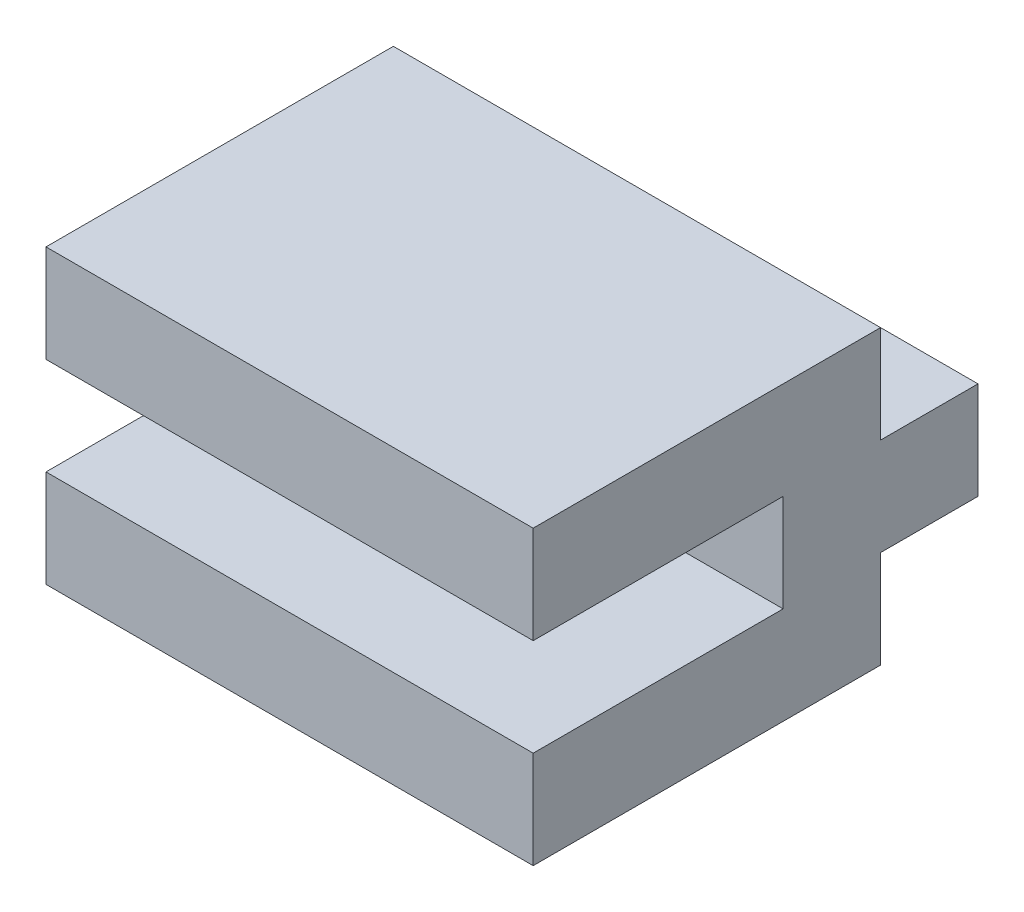
ISO-10303-21;
HEADER;
FILE_DESCRIPTION(('STEP AP214'),'2;1');
FILE_NAME('part.step','',(''),(''),'','','');
FILE_SCHEMA(('AUTOMOTIVE_DESIGN { 1 0 10303 214 1 1 1 1 }'));
ENDSEC;
DATA;
#1=APPLICATION_CONTEXT('core data for automotive mechanical design processes');
#2=APPLICATION_PROTOCOL_DEFINITION('international standard','automotive_design',2000,#1);
#3=PRODUCT_CONTEXT('',#1,'mechanical');
#4=PRODUCT('Part','Part','',(#3));
#5=PRODUCT_RELATED_PRODUCT_CATEGORY('part','',(#4));
#6=PRODUCT_DEFINITION_FORMATION('','',#4);
#7=PRODUCT_DEFINITION_CONTEXT('part definition',#1,'design');
#8=PRODUCT_DEFINITION('design','',#6,#7);
#9=PRODUCT_DEFINITION_SHAPE('','',#8);
#10=(LENGTH_UNIT() NAMED_UNIT(*) SI_UNIT(.MILLI.,.METRE.));
#11=(NAMED_UNIT(*) PLANE_ANGLE_UNIT() SI_UNIT($,.RADIAN.));
#12=(NAMED_UNIT(*) SI_UNIT($,.STERADIAN.) SOLID_ANGLE_UNIT());
#13=UNCERTAINTY_MEASURE_WITH_UNIT(LENGTH_MEASURE(1.E-05),#10,'distance_accuracy_value','');
#14=(GEOMETRIC_REPRESENTATION_CONTEXT(3) GLOBAL_UNCERTAINTY_ASSIGNED_CONTEXT((#13)) GLOBAL_UNIT_ASSIGNED_CONTEXT((#10,
#11,#12)) REPRESENTATION_CONTEXT('',''));
#15=CARTESIAN_POINT('',(0.,0.,0.));
#16=DIRECTION('',(0.,0.,1.));
#17=DIRECTION('',(1.,0.,0.));
#18=AXIS2_PLACEMENT_3D('',#15,#16,#17);
#19=CARTESIAN_POINT('',(10.,1.,3.56528437442263));
#20=DIRECTION('',(0.,0.,-1.));
#21=DIRECTION('',(-1.,0.,0.));
#22=AXIS2_PLACEMENT_3D('',#19,#20,#21);
#23=PLANE('',#22);
#24=DIRECTION('',(0.,-1.,0.));
#25=VECTOR('',#24,1.);
#26=CARTESIAN_POINT('',(0.,1.,3.56528437442263));
#27=LINE('',#26,#25);
#28=CARTESIAN_POINT('',(0.,3.,3.56528437442263));
#29=VERTEX_POINT('',#28);
#30=CARTESIAN_POINT('',(0.,1.,3.56528437442263));
#31=VERTEX_POINT('',#30);
#32=EDGE_CURVE('E164',#29,#31,#27,.T.);
#33=ORIENTED_EDGE('',*,*,#32,.T.);
#34=DIRECTION('',(-1.,0.,0.));
#35=VECTOR('',#34,1.);
#36=CARTESIAN_POINT('',(10.,1.,3.56528437442263));
#37=LINE('',#36,#35);
#38=CARTESIAN_POINT('',(10.,1.,3.56528437442263));
#39=VERTEX_POINT('',#38);
#40=EDGE_CURVE('E11',#39,#31,#37,.T.);
#41=ORIENTED_EDGE('',*,*,#40,.F.);
#42=DIRECTION('',(0.,-1.,0.));
#43=VECTOR('',#42,1.);
#44=CARTESIAN_POINT('',(10.,1.,3.56528437442263));
#45=LINE('',#44,#43);
#46=CARTESIAN_POINT('',(10.,3.,3.56528437442263));
#47=VERTEX_POINT('',#46);
#48=EDGE_CURVE('E198',#47,#39,#45,.T.);
#49=ORIENTED_EDGE('',*,*,#48,.F.);
#50=DIRECTION('',(-1.,0.,0.));
#51=VECTOR('',#50,1.);
#52=CARTESIAN_POINT('',(10.,3.,3.56528437442263));
#53=LINE('',#52,#51);
#54=EDGE_CURVE('E160',#47,#29,#53,.T.);
#55=ORIENTED_EDGE('',*,*,#54,.T.);
#56=EDGE_LOOP('',(#33,#41,#49,#55));
#57=FACE_BOUND('',#56,.T.);
#58=ADVANCED_FACE('F39',(#57),#23,.F.);
#59=CARTESIAN_POINT('',(10.,1.,-1.56528437442264));
#60=DIRECTION('',(0.,1.,0.));
#61=DIRECTION('',(0.,0.,1.));
#62=AXIS2_PLACEMENT_3D('',#59,#60,#61);
#63=PLANE('',#62);
#64=DIRECTION('',(0.,0.,-1.));
#65=VECTOR('',#64,1.);
#66=CARTESIAN_POINT('',(0.,1.,-1.56528437442264));
#67=LINE('',#66,#65);
#68=CARTESIAN_POINT('',(0.,1.,-1.56528437442264));
#69=VERTEX_POINT('',#68);
#70=EDGE_CURVE('E168',#31,#69,#67,.T.);
#71=ORIENTED_EDGE('',*,*,#70,.T.);
#72=DIRECTION('',(-1.,0.,0.));
#73=VECTOR('',#72,1.);
#74=CARTESIAN_POINT('',(10.,1.,-1.56528437442264));
#75=LINE('',#74,#73);
#76=CARTESIAN_POINT('',(10.,1.,-1.56528437442264));
#77=VERTEX_POINT('',#76);
#78=EDGE_CURVE('E48',#77,#69,#75,.T.);
#79=ORIENTED_EDGE('',*,*,#78,.F.);
#80=DIRECTION('',(0.,0.,-1.));
#81=VECTOR('',#80,1.);
#82=CARTESIAN_POINT('',(10.,1.,-1.56528437442264));
#83=LINE('',#82,#81);
#84=EDGE_CURVE('E111',#39,#77,#83,.T.);
#85=ORIENTED_EDGE('',*,*,#84,.F.);
#86=ORIENTED_EDGE('',*,*,#40,.T.);
#87=EDGE_LOOP('',(#71,#79,#85,#86));
#88=FACE_BOUND('',#87,.T.);
#89=ADVANCED_FACE('F292',(#88),#63,.F.);
#90=CARTESIAN_POINT('',(10.,-0.999999999999999,-1.56528437442264));
#91=DIRECTION('',(0.,0.,-1.));
#92=DIRECTION('',(0.,1.,0.));
#93=AXIS2_PLACEMENT_3D('',#90,#91,#92);
#94=PLANE('',#93);
#95=DIRECTION('',(0.,-1.,0.));
#96=VECTOR('',#95,1.);
#97=CARTESIAN_POINT('',(0.,-0.999999999999999,-1.56528437442264));
#98=LINE('',#97,#96);
#99=CARTESIAN_POINT('',(0.,-0.999999999999999,-1.56528437442264));
#100=VERTEX_POINT('',#99);
#101=EDGE_CURVE('E171',#69,#100,#98,.T.);
#102=ORIENTED_EDGE('',*,*,#101,.T.);
#103=DIRECTION('',(-1.,0.,0.));
#104=VECTOR('',#103,1.);
#105=CARTESIAN_POINT('',(10.,-0.999999999999999,-1.56528437442264));
#106=LINE('',#105,#104);
#107=CARTESIAN_POINT('',(10.,-0.999999999999999,-1.56528437442264));
#108=VERTEX_POINT('',#107);
#109=EDGE_CURVE('E225',#108,#100,#106,.T.);
#110=ORIENTED_EDGE('',*,*,#109,.F.);
#111=DIRECTION('',(0.,-1.,0.));
#112=VECTOR('',#111,1.);
#113=CARTESIAN_POINT('',(10.,-0.999999999999999,-1.56528437442264));
#114=LINE('',#113,#112);
#115=EDGE_CURVE('E235',#77,#108,#114,.T.);
#116=ORIENTED_EDGE('',*,*,#115,.F.);
#117=ORIENTED_EDGE('',*,*,#78,.T.);
#118=EDGE_LOOP('',(#102,#110,#116,#117));
#119=FACE_BOUND('',#118,.T.);
#120=ADVANCED_FACE('F233',(#119),#94,.F.);
#121=CARTESIAN_POINT('',(10.,-0.999999999999999,-1.56528437442264));
#122=DIRECTION('',(0.,-1.,0.));
#123=DIRECTION('',(0.,0.,-1.));
#124=AXIS2_PLACEMENT_3D('',#121,#122,#123);
#125=PLANE('',#124);
#126=DIRECTION('',(0.,0.,1.));
#127=VECTOR('',#126,1.);
#128=CARTESIAN_POINT('',(0.,-0.999999999999999,-1.56528437442264));
#129=LINE('',#128,#127);
#130=CARTESIAN_POINT('',(0.,-0.999999999999999,3.56528437442263));
#131=VERTEX_POINT('',#130);
#132=EDGE_CURVE('E174',#100,#131,#129,.T.);
#133=ORIENTED_EDGE('',*,*,#132,.T.);
#134=DIRECTION('',(-1.,0.,0.));
#135=VECTOR('',#134,1.);
#136=CARTESIAN_POINT('',(10.,-0.999999999999999,3.56528437442263));
#137=LINE('',#136,#135);
#138=CARTESIAN_POINT('',(10.,-0.999999999999999,3.56528437442263));
#139=VERTEX_POINT('',#138);
#140=EDGE_CURVE('E221',#139,#131,#137,.T.);
#141=ORIENTED_EDGE('',*,*,#140,.F.);
#142=DIRECTION('',(0.,0.,1.));
#143=VECTOR('',#142,1.);
#144=CARTESIAN_POINT('',(10.,-0.999999999999999,-1.56528437442264));
#145=LINE('',#144,#143);
#146=EDGE_CURVE('E254',#108,#139,#145,.T.);
#147=ORIENTED_EDGE('',*,*,#146,.F.);
#148=ORIENTED_EDGE('',*,*,#109,.T.);
#149=EDGE_LOOP('',(#133,#141,#147,#148));
#150=FACE_BOUND('',#149,.T.);
#151=ADVANCED_FACE('F244',(#150),#125,.F.);
#152=CARTESIAN_POINT('',(10.,-3.,3.56528437442263));
#153=DIRECTION('',(0.,0.,-1.));
#154=DIRECTION('',(-1.,0.,0.));
#155=AXIS2_PLACEMENT_3D('',#152,#153,#154);
#156=PLANE('',#155);
#157=DIRECTION('',(0.,-1.,0.));
#158=VECTOR('',#157,1.);
#159=CARTESIAN_POINT('',(0.,-3.,3.56528437442263));
#160=LINE('',#159,#158);
#161=CARTESIAN_POINT('',(0.,-3.,3.56528437442263));
#162=VERTEX_POINT('',#161);
#163=EDGE_CURVE('E177',#131,#162,#160,.T.);
#164=ORIENTED_EDGE('',*,*,#163,.T.);
#165=DIRECTION('',(-1.,0.,0.));
#166=VECTOR('',#165,1.);
#167=CARTESIAN_POINT('',(10.,-3.,3.56528437442263));
#168=LINE('',#167,#166);
#169=CARTESIAN_POINT('',(10.,-3.,3.56528437442263));
#170=VERTEX_POINT('',#169);
#171=EDGE_CURVE('E217',#170,#162,#168,.T.);
#172=ORIENTED_EDGE('',*,*,#171,.F.);
#173=DIRECTION('',(0.,-1.,0.));
#174=VECTOR('',#173,1.);
#175=CARTESIAN_POINT('',(10.,-3.,3.56528437442263));
#176=LINE('',#175,#174);
#177=EDGE_CURVE('E250',#139,#170,#176,.T.);
#178=ORIENTED_EDGE('',*,*,#177,.F.);
#179=ORIENTED_EDGE('',*,*,#140,.T.);
#180=EDGE_LOOP('',(#164,#172,#178,#179));
#181=FACE_BOUND('',#180,.T.);
#182=ADVANCED_FACE('F248',(#181),#156,.F.);
#183=CARTESIAN_POINT('',(10.,-3.,-3.56528437442263));
#184=DIRECTION('',(0.,1.,0.));
#185=DIRECTION('',(0.,0.,1.));
#186=AXIS2_PLACEMENT_3D('',#183,#184,#185);
#187=PLANE('',#186);
#188=DIRECTION('',(0.,0.,-1.));
#189=VECTOR('',#188,1.);
#190=CARTESIAN_POINT('',(0.,-3.,-3.56528437442263));
#191=LINE('',#190,#189);
#192=CARTESIAN_POINT('',(0.,-3.,-3.56528437442263));
#193=VERTEX_POINT('',#192);
#194=EDGE_CURVE('E180',#162,#193,#191,.T.);
#195=ORIENTED_EDGE('',*,*,#194,.T.);
#196=DIRECTION('',(-1.,0.,0.));
#197=VECTOR('',#196,1.);
#198=CARTESIAN_POINT('',(10.,-3.,-3.56528437442263));
#199=LINE('',#198,#197);
#200=CARTESIAN_POINT('',(10.,-3.,-3.56528437442263));
#201=VERTEX_POINT('',#200);
#202=EDGE_CURVE('E213',#201,#193,#199,.T.);
#203=ORIENTED_EDGE('',*,*,#202,.F.);
#204=DIRECTION('',(0.,0.,-1.));
#205=VECTOR('',#204,1.);
#206=CARTESIAN_POINT('',(10.,-3.,-3.56528437442263));
#207=LINE('',#206,#205);
#208=EDGE_CURVE('E253',#170,#201,#207,.T.);
#209=ORIENTED_EDGE('',*,*,#208,.F.);
#210=ORIENTED_EDGE('',*,*,#171,.T.);
#211=EDGE_LOOP('',(#195,#203,#209,#210));
#212=FACE_BOUND('',#211,.T.);
#213=ADVANCED_FACE('F305',(#212),#187,.F.);
#214=CARTESIAN_POINT('',(10.,-3.,-3.56528437442263));
#215=DIRECTION('',(0.,0.,1.));
#216=DIRECTION('',(1.,0.,0.));
#217=AXIS2_PLACEMENT_3D('',#214,#215,#216);
#218=PLANE('',#217);
#219=DIRECTION('',(0.,1.,0.));
#220=VECTOR('',#219,1.);
#221=CARTESIAN_POINT('',(0.,-3.,-3.56528437442263));
#222=LINE('',#221,#220);
#223=CARTESIAN_POINT('',(0.,-1.,-3.56528437442263));
#224=VERTEX_POINT('',#223);
#225=EDGE_CURVE('E183',#193,#224,#222,.T.);
#226=ORIENTED_EDGE('',*,*,#225,.T.);
#227=DIRECTION('',(-1.,0.,0.));
#228=VECTOR('',#227,1.);
#229=CARTESIAN_POINT('',(10.,-1.,-3.56528437442263));
#230=LINE('',#229,#228);
#231=CARTESIAN_POINT('',(10.,-1.,-3.56528437442263));
#232=VERTEX_POINT('',#231);
#233=EDGE_CURVE('E209',#232,#224,#230,.T.);
#234=ORIENTED_EDGE('',*,*,#233,.F.);
#235=DIRECTION('',(0.,1.,0.));
#236=VECTOR('',#235,1.);
#237=CARTESIAN_POINT('',(10.,-3.,-3.56528437442263));
#238=LINE('',#237,#236);
#239=EDGE_CURVE('E258',#201,#232,#238,.T.);
#240=ORIENTED_EDGE('',*,*,#239,.F.);
#241=ORIENTED_EDGE('',*,*,#202,.T.);
#242=EDGE_LOOP('',(#226,#234,#240,#241));
#243=FACE_BOUND('',#242,.T.);
#244=ADVANCED_FACE('F308',(#243),#218,.F.);
#245=CARTESIAN_POINT('',(10.,-0.999999999999999,-5.56528437442264));
#246=DIRECTION('',(0.,1.,0.));
#247=DIRECTION('',(0.,0.,1.));
#248=AXIS2_PLACEMENT_3D('',#245,#246,#247);
#249=PLANE('',#248);
#250=DIRECTION('',(0.,0.,-1.));
#251=VECTOR('',#250,1.);
#252=CARTESIAN_POINT('',(0.,-0.999999999999999,-5.56528437442264));
#253=LINE('',#252,#251);
#254=CARTESIAN_POINT('',(0.,-0.999999999999999,-5.56528437442264));
#255=VERTEX_POINT('',#254);
#256=EDGE_CURVE('E186',#224,#255,#253,.T.);
#257=ORIENTED_EDGE('',*,*,#256,.T.);
#258=DIRECTION('',(-1.,0.,0.));
#259=VECTOR('',#258,1.);
#260=CARTESIAN_POINT('',(10.,-0.999999999999999,-5.56528437442264));
#261=LINE('',#260,#259);
#262=CARTESIAN_POINT('',(10.,-0.999999999999999,-5.56528437442264));
#263=VERTEX_POINT('',#262);
#264=EDGE_CURVE('E205',#263,#255,#261,.T.);
#265=ORIENTED_EDGE('',*,*,#264,.F.);
#266=DIRECTION('',(0.,0.,-1.));
#267=VECTOR('',#266,1.);
#268=CARTESIAN_POINT('',(10.,-0.999999999999999,-5.56528437442264));
#269=LINE('',#268,#267);
#270=EDGE_CURVE('E265',#232,#263,#269,.T.);
#271=ORIENTED_EDGE('',*,*,#270,.F.);
#272=ORIENTED_EDGE('',*,*,#233,.T.);
#273=EDGE_LOOP('',(#257,#265,#271,#272));
#274=FACE_BOUND('',#273,.T.);
#275=ADVANCED_FACE('F273',(#274),#249,.F.);
#276=CARTESIAN_POINT('',(10.,-0.999999999999999,-5.56528437442264));
#277=DIRECTION('',(0.,0.,1.));
#278=DIRECTION('',(1.,0.,0.));
#279=AXIS2_PLACEMENT_3D('',#276,#277,#278);
#280=PLANE('',#279);
#281=DIRECTION('',(0.,1.,0.));
#282=VECTOR('',#281,1.);
#283=CARTESIAN_POINT('',(0.,-0.999999999999999,-5.56528437442264));
#284=LINE('',#283,#282);
#285=CARTESIAN_POINT('',(0.,1.,-5.56528437442264));
#286=VERTEX_POINT('',#285);
#287=EDGE_CURVE('E189',#255,#286,#284,.T.);
#288=ORIENTED_EDGE('',*,*,#287,.T.);
#289=DIRECTION('',(-1.,0.,0.));
#290=VECTOR('',#289,1.);
#291=CARTESIAN_POINT('',(10.,1.,-5.56528437442264));
#292=LINE('',#291,#290);
#293=CARTESIAN_POINT('',(10.,1.,-5.56528437442264));
#294=VERTEX_POINT('',#293);
#295=EDGE_CURVE('E153',#294,#286,#292,.T.);
#296=ORIENTED_EDGE('',*,*,#295,.F.);
#297=DIRECTION('',(0.,1.,0.));
#298=VECTOR('',#297,1.);
#299=CARTESIAN_POINT('',(10.,-0.999999999999999,-5.56528437442264));
#300=LINE('',#299,#298);
#301=EDGE_CURVE('E142',#263,#294,#300,.T.);
#302=ORIENTED_EDGE('',*,*,#301,.F.);
#303=ORIENTED_EDGE('',*,*,#264,.T.);
#304=EDGE_LOOP('',(#288,#296,#302,#303));
#305=FACE_BOUND('',#304,.T.);
#306=ADVANCED_FACE('F277',(#305),#280,.F.);
#307=CARTESIAN_POINT('',(10.,1.,-5.56528437442264));
#308=DIRECTION('',(0.,-1.,0.));
#309=DIRECTION('',(0.,0.,-1.));
#310=AXIS2_PLACEMENT_3D('',#307,#308,#309);
#311=PLANE('',#310);
#312=DIRECTION('',(0.,0.,1.));
#313=VECTOR('',#312,1.);
#314=CARTESIAN_POINT('',(0.,1.,-5.56528437442264));
#315=LINE('',#314,#313);
#316=CARTESIAN_POINT('',(0.,1.,-3.56528437442263));
#317=VERTEX_POINT('',#316);
#318=EDGE_CURVE('E151',#286,#317,#315,.T.);
#319=ORIENTED_EDGE('',*,*,#318,.T.);
#320=DIRECTION('',(-1.,0.,0.));
#321=VECTOR('',#320,1.);
#322=CARTESIAN_POINT('',(10.,1.,-3.56528437442263));
#323=LINE('',#322,#321);
#324=CARTESIAN_POINT('',(10.,1.,-3.56528437442263));
#325=VERTEX_POINT('',#324);
#326=EDGE_CURVE('E148',#325,#317,#323,.T.);
#327=ORIENTED_EDGE('',*,*,#326,.F.);
#328=DIRECTION('',(0.,0.,1.));
#329=VECTOR('',#328,1.);
#330=CARTESIAN_POINT('',(10.,1.,-5.56528437442264));
#331=LINE('',#330,#329);
#332=EDGE_CURVE('E136',#294,#325,#331,.T.);
#333=ORIENTED_EDGE('',*,*,#332,.F.);
#334=ORIENTED_EDGE('',*,*,#295,.T.);
#335=EDGE_LOOP('',(#319,#327,#333,#334));
#336=FACE_BOUND('',#335,.T.);
#337=ADVANCED_FACE('F149',(#336),#311,.F.);
#338=CARTESIAN_POINT('',(10.,1.,-3.56528437442263));
#339=DIRECTION('',(0.,0.,1.));
#340=DIRECTION('',(1.,0.,0.));
#341=AXIS2_PLACEMENT_3D('',#338,#339,#340);
#342=PLANE('',#341);
#343=DIRECTION('',(0.,1.,0.));
#344=VECTOR('',#343,1.);
#345=CARTESIAN_POINT('',(0.,1.,-3.56528437442263));
#346=LINE('',#345,#344);
#347=CARTESIAN_POINT('',(0.,3.,-3.56528437442263));
#348=VERTEX_POINT('',#347);
#349=EDGE_CURVE('E97',#317,#348,#346,.T.);
#350=ORIENTED_EDGE('',*,*,#349,.T.);
#351=DIRECTION('',(-1.,0.,0.));
#352=VECTOR('',#351,1.);
#353=CARTESIAN_POINT('',(10.,3.,-3.56528437442263));
#354=LINE('',#353,#352);
#355=CARTESIAN_POINT('',(10.,3.,-3.56528437442263));
#356=VERTEX_POINT('',#355);
#357=EDGE_CURVE('E154',#356,#348,#354,.T.);
#358=ORIENTED_EDGE('',*,*,#357,.F.);
#359=DIRECTION('',(0.,1.,0.));
#360=VECTOR('',#359,1.);
#361=CARTESIAN_POINT('',(10.,1.,-3.56528437442263));
#362=LINE('',#361,#360);
#363=EDGE_CURVE('E140',#325,#356,#362,.T.);
#364=ORIENTED_EDGE('',*,*,#363,.F.);
#365=ORIENTED_EDGE('',*,*,#326,.T.);
#366=EDGE_LOOP('',(#350,#358,#364,#365));
#367=FACE_BOUND('',#366,.T.);
#368=ADVANCED_FACE('F156',(#367),#342,.F.);
#369=CARTESIAN_POINT('',(10.,3.,-3.56528437442263));
#370=DIRECTION('',(0.,-1.,0.));
#371=DIRECTION('',(0.,0.,-1.));
#372=AXIS2_PLACEMENT_3D('',#369,#370,#371);
#373=PLANE('',#372);
#374=DIRECTION('',(0.,0.,1.));
#375=VECTOR('',#374,1.);
#376=CARTESIAN_POINT('',(0.,3.,-3.56528437442263));
#377=LINE('',#376,#375);
#378=EDGE_CURVE('E103',#348,#29,#377,.T.);
#379=ORIENTED_EDGE('',*,*,#378,.T.);
#380=ORIENTED_EDGE('',*,*,#54,.F.);
#381=DIRECTION('',(0.,0.,1.));
#382=VECTOR('',#381,1.);
#383=CARTESIAN_POINT('',(10.,3.,-3.56528437442263));
#384=LINE('',#383,#382);
#385=EDGE_CURVE('E56',#356,#47,#384,.T.);
#386=ORIENTED_EDGE('',*,*,#385,.F.);
#387=ORIENTED_EDGE('',*,*,#357,.T.);
#388=EDGE_LOOP('',(#379,#380,#386,#387));
#389=FACE_BOUND('',#388,.T.);
#390=ADVANCED_FACE('F281',(#389),#373,.F.);
#391=CARTESIAN_POINT('',(10.,0.,0.));
#392=DIRECTION('',(1.,0.,0.));
#393=DIRECTION('',(0.,0.,-1.));
#394=AXIS2_PLACEMENT_3D('',#391,#392,#393);
#395=PLANE('',#394);
#396=ORIENTED_EDGE('',*,*,#48,.T.);
#397=ORIENTED_EDGE('',*,*,#84,.T.);
#398=ORIENTED_EDGE('',*,*,#115,.T.);
#399=ORIENTED_EDGE('',*,*,#146,.T.);
#400=ORIENTED_EDGE('',*,*,#177,.T.);
#401=ORIENTED_EDGE('',*,*,#208,.T.);
#402=ORIENTED_EDGE('',*,*,#239,.T.);
#403=ORIENTED_EDGE('',*,*,#270,.T.);
#404=ORIENTED_EDGE('',*,*,#301,.T.);
#405=ORIENTED_EDGE('',*,*,#332,.T.);
#406=ORIENTED_EDGE('',*,*,#363,.T.);
#407=ORIENTED_EDGE('',*,*,#385,.T.);
#408=EDGE_LOOP('',(#396,#397,#398,#399,#400,#401,#402,#403,#404,#405,#406,#407));
#409=FACE_BOUND('',#408,.T.);
#410=ADVANCED_FACE('F138',(#409),#395,.T.);
#411=CARTESIAN_POINT('',(0.,0.,0.));
#412=DIRECTION('',(1.,0.,0.));
#413=DIRECTION('',(0.,0.,-1.));
#414=AXIS2_PLACEMENT_3D('',#411,#412,#413);
#415=PLANE('',#414);
#416=ORIENTED_EDGE('',*,*,#32,.F.);
#417=ORIENTED_EDGE('',*,*,#378,.F.);
#418=ORIENTED_EDGE('',*,*,#349,.F.);
#419=ORIENTED_EDGE('',*,*,#318,.F.);
#420=ORIENTED_EDGE('',*,*,#287,.F.);
#421=ORIENTED_EDGE('',*,*,#256,.F.);
#422=ORIENTED_EDGE('',*,*,#225,.F.);
#423=ORIENTED_EDGE('',*,*,#194,.F.);
#424=ORIENTED_EDGE('',*,*,#163,.F.);
#425=ORIENTED_EDGE('',*,*,#132,.F.);
#426=ORIENTED_EDGE('',*,*,#101,.F.);
#427=ORIENTED_EDGE('',*,*,#70,.F.);
#428=EDGE_LOOP('',(#416,#417,#418,#419,#420,#421,#422,#423,#424,#425,#426,#427));
#429=FACE_BOUND('',#428,.T.);
#430=ADVANCED_FACE('F239',(#429),#415,.F.);
#431=CLOSED_SHELL('',(#58,#89,#120,#151,#182,#213,#244,#275,#306,#337,#368,#390,#410,#430));
#432=MANIFOLD_SOLID_BREP('B2',#431);
#433=ADVANCED_BREP_SHAPE_REPRESENTATION('',(#18,#432),#14);
#434=SHAPE_DEFINITION_REPRESENTATION(#9,#433);
ENDSEC;
END-ISO-10303-21;
